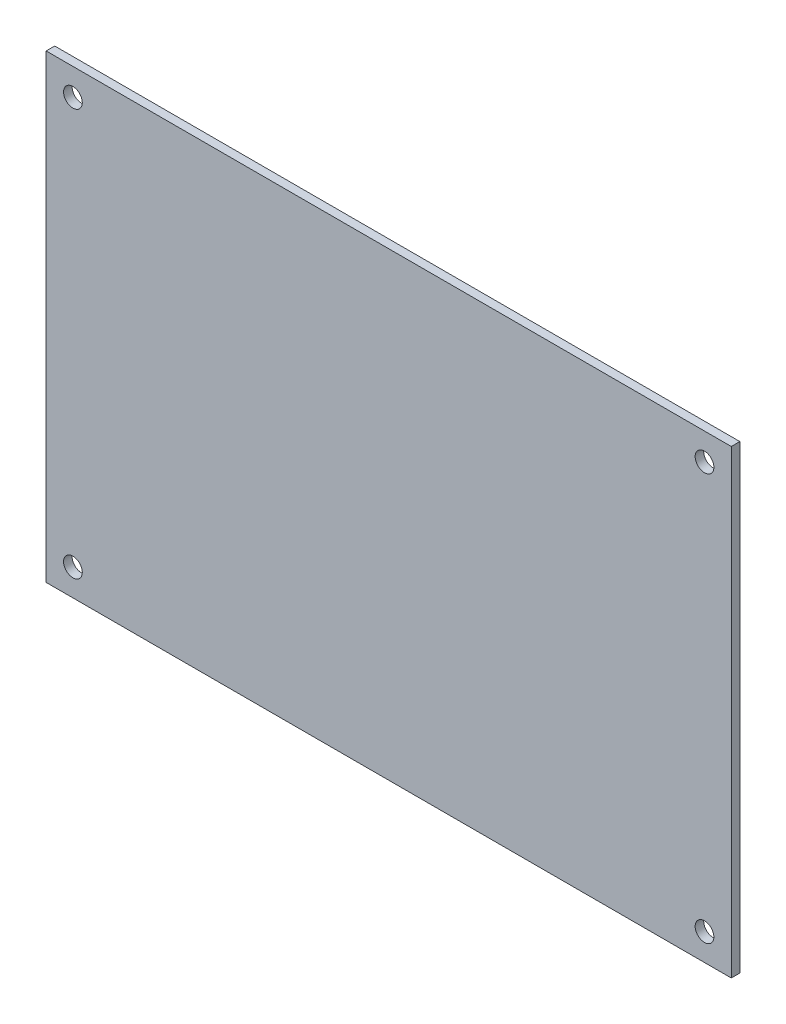
ISO-10303-21;
HEADER;
FILE_DESCRIPTION(('STEP AP214'),'2;1');
FILE_NAME('part.step','',(''),(''),'','','');
FILE_SCHEMA(('AUTOMOTIVE_DESIGN { 1 0 10303 214 1 1 1 1 }'));
ENDSEC;
DATA;
#1=APPLICATION_CONTEXT('core data for automotive mechanical design processes');
#2=APPLICATION_PROTOCOL_DEFINITION('international standard','automotive_design',2000,#1);
#3=PRODUCT_CONTEXT('',#1,'mechanical');
#4=PRODUCT('Part','Part','',(#3));
#5=PRODUCT_RELATED_PRODUCT_CATEGORY('part','',(#4));
#6=PRODUCT_DEFINITION_FORMATION('','',#4);
#7=PRODUCT_DEFINITION_CONTEXT('part definition',#1,'design');
#8=PRODUCT_DEFINITION('design','',#6,#7);
#9=PRODUCT_DEFINITION_SHAPE('','',#8);
#10=(LENGTH_UNIT() NAMED_UNIT(*) SI_UNIT(.MILLI.,.METRE.));
#11=(NAMED_UNIT(*) PLANE_ANGLE_UNIT() SI_UNIT($,.RADIAN.));
#12=(NAMED_UNIT(*) SI_UNIT($,.STERADIAN.) SOLID_ANGLE_UNIT());
#13=UNCERTAINTY_MEASURE_WITH_UNIT(LENGTH_MEASURE(1.E-05),#10,'distance_accuracy_value','');
#14=(GEOMETRIC_REPRESENTATION_CONTEXT(3) GLOBAL_UNCERTAINTY_ASSIGNED_CONTEXT((#13)) GLOBAL_UNIT_ASSIGNED_CONTEXT((#10,
#11,#12)) REPRESENTATION_CONTEXT('',''));
#15=CARTESIAN_POINT('',(0.,0.,0.));
#16=DIRECTION('',(0.,0.,1.));
#17=DIRECTION('',(1.,0.,0.));
#18=AXIS2_PLACEMENT_3D('',#15,#16,#17);
#19=CARTESIAN_POINT('',(39.9423506910812,22.6008886002444,0.5));
#20=DIRECTION('',(0.,0.,1.));
#21=DIRECTION('',(1.,0.,0.));
#22=AXIS2_PLACEMENT_3D('',#19,#20,#21);
#23=PLANE('',#22);
#24=DIRECTION('',(1.,0.,0.));
#25=VECTOR('',#24,1.);
#26=CARTESIAN_POINT('',(-14.0576493089189,55.6008886002444,0.5));
#27=LINE('',#26,#25);
#28=CARTESIAN_POINT('',(-14.0576493089188,55.6008886002444,0.5));
#29=VERTEX_POINT('',#28);
#30=CARTESIAN_POINT('',(93.9423506910812,55.6008886002444,0.5));
#31=VERTEX_POINT('',#30);
#32=EDGE_CURVE('E82',#29,#31,#27,.T.);
#33=ORIENTED_EDGE('',*,*,#32,.T.);
#34=DIRECTION('',(0.,1.,0.));
#35=VECTOR('',#34,1.);
#36=CARTESIAN_POINT('',(93.9423506910812,55.6008886002444,0.5));
#37=LINE('',#36,#35);
#38=CARTESIAN_POINT('',(93.9423506910812,-10.3991113997556,0.5));
#39=VERTEX_POINT('',#38);
#40=EDGE_CURVE('E79',#31,#39,#37,.F.);
#41=ORIENTED_EDGE('',*,*,#40,.T.);
#42=DIRECTION('',(1.,0.,0.));
#43=VECTOR('',#42,1.);
#44=CARTESIAN_POINT('',(93.9423506910812,-10.3991113997556,0.5));
#45=LINE('',#44,#43);
#46=CARTESIAN_POINT('',(-14.0576493089188,-10.3991113997556,0.5));
#47=VERTEX_POINT('',#46);
#48=EDGE_CURVE('E102',#39,#47,#45,.F.);
#49=ORIENTED_EDGE('',*,*,#48,.T.);
#50=DIRECTION('',(0.,1.,0.));
#51=VECTOR('',#50,1.);
#52=CARTESIAN_POINT('',(-14.0576493089188,-10.3991113997556,0.5));
#53=LINE('',#52,#51);
#54=EDGE_CURVE('E85',#47,#29,#53,.T.);
#55=ORIENTED_EDGE('',*,*,#54,.T.);
#56=EDGE_LOOP('',(#33,#41,#49,#55));
#57=FACE_BOUND('',#56,.T.);
#58=ADVANCED_FACE('F17',(#57),#23,.F.);
#59=CARTESIAN_POINT('',(-14.0576493089189,55.6008886002444,0.));
#60=DIRECTION('',(0.,1.,0.));
#61=DIRECTION('',(0.,0.,1.));
#62=AXIS2_PLACEMENT_3D('',#59,#60,#61);
#63=PLANE('',#62);
#64=DIRECTION('',(0.,0.,1.));
#65=VECTOR('',#64,1.);
#66=CARTESIAN_POINT('',(-14.0576493089188,55.6008886002444,0.));
#67=LINE('',#66,#65);
#68=CARTESIAN_POINT('',(-14.0576493089188,55.6008886002444,0.));
#69=VERTEX_POINT('',#68);
#70=EDGE_CURVE('E165',#29,#69,#67,.F.);
#71=ORIENTED_EDGE('',*,*,#70,.T.);
#72=DIRECTION('',(1.,0.,0.));
#73=VECTOR('',#72,1.);
#74=CARTESIAN_POINT('',(39.9423506910812,55.6008886002444,0.));
#75=LINE('',#74,#73);
#76=CARTESIAN_POINT('',(93.9423506910812,55.6008886002444,0.));
#77=VERTEX_POINT('',#76);
#78=EDGE_CURVE('E93',#69,#77,#75,.T.);
#79=ORIENTED_EDGE('',*,*,#78,.T.);
#80=DIRECTION('',(0.,0.,-1.));
#81=VECTOR('',#80,1.);
#82=CARTESIAN_POINT('',(93.9423506910812,55.6008886002444,0.));
#83=LINE('',#82,#81);
#84=EDGE_CURVE('E88',#77,#31,#83,.F.);
#85=ORIENTED_EDGE('',*,*,#84,.T.);
#86=ORIENTED_EDGE('',*,*,#32,.F.);
#87=EDGE_LOOP('',(#71,#79,#85,#86));
#88=FACE_BOUND('',#87,.T.);
#89=ADVANCED_FACE('F91',(#88),#63,.F.);
#90=CARTESIAN_POINT('',(93.9423506910812,55.6008886002444,0.));
#91=DIRECTION('',(1.,0.,0.));
#92=DIRECTION('',(0.,0.,-1.));
#93=AXIS2_PLACEMENT_3D('',#90,#91,#92);
#94=PLANE('',#93);
#95=ORIENTED_EDGE('',*,*,#84,.F.);
#96=DIRECTION('',(0.,1.,0.));
#97=VECTOR('',#96,1.);
#98=CARTESIAN_POINT('',(93.9423506910812,22.6008886002444,0.));
#99=LINE('',#98,#97);
#100=CARTESIAN_POINT('',(93.9423506910812,-10.3991113997556,0.));
#101=VERTEX_POINT('',#100);
#102=EDGE_CURVE('E158',#77,#101,#99,.F.);
#103=ORIENTED_EDGE('',*,*,#102,.T.);
#104=DIRECTION('',(0.,0.,-1.));
#105=VECTOR('',#104,1.);
#106=CARTESIAN_POINT('',(93.9423506910812,-10.3991113997556,0.));
#107=LINE('',#106,#105);
#108=EDGE_CURVE('E99',#101,#39,#107,.F.);
#109=ORIENTED_EDGE('',*,*,#108,.T.);
#110=ORIENTED_EDGE('',*,*,#40,.F.);
#111=EDGE_LOOP('',(#95,#103,#109,#110));
#112=FACE_BOUND('',#111,.T.);
#113=ADVANCED_FACE('F97',(#112),#94,.F.);
#114=CARTESIAN_POINT('',(93.9423506910812,-10.3991113997556,0.));
#115=DIRECTION('',(0.,-1.,0.));
#116=DIRECTION('',(0.,0.,-1.));
#117=AXIS2_PLACEMENT_3D('',#114,#115,#116);
#118=PLANE('',#117);
#119=ORIENTED_EDGE('',*,*,#108,.F.);
#120=DIRECTION('',(1.,0.,0.));
#121=VECTOR('',#120,1.);
#122=CARTESIAN_POINT('',(39.9423506910812,-10.3991113997556,0.));
#123=LINE('',#122,#121);
#124=CARTESIAN_POINT('',(-14.0576493089188,-10.3991113997556,0.));
#125=VERTEX_POINT('',#124);
#126=EDGE_CURVE('E156',#101,#125,#123,.F.);
#127=ORIENTED_EDGE('',*,*,#126,.T.);
#128=DIRECTION('',(0.,0.,1.));
#129=VECTOR('',#128,1.);
#130=CARTESIAN_POINT('',(-14.0576493089188,-10.3991113997556,0.));
#131=LINE('',#130,#129);
#132=EDGE_CURVE('E162',#125,#47,#131,.T.);
#133=ORIENTED_EDGE('',*,*,#132,.T.);
#134=ORIENTED_EDGE('',*,*,#48,.F.);
#135=EDGE_LOOP('',(#119,#127,#133,#134));
#136=FACE_BOUND('',#135,.T.);
#137=ADVANCED_FACE('F168',(#136),#118,.F.);
#138=CARTESIAN_POINT('',(-14.0576493089188,-10.3991113997556,0.));
#139=DIRECTION('',(-1.,0.,0.));
#140=DIRECTION('',(0.,0.,1.));
#141=AXIS2_PLACEMENT_3D('',#138,#139,#140);
#142=PLANE('',#141);
#143=ORIENTED_EDGE('',*,*,#132,.F.);
#144=DIRECTION('',(0.,1.,0.));
#145=VECTOR('',#144,1.);
#146=CARTESIAN_POINT('',(-14.0576493089188,22.6008886002444,0.));
#147=LINE('',#146,#145);
#148=EDGE_CURVE('E153',#125,#69,#147,.T.);
#149=ORIENTED_EDGE('',*,*,#148,.T.);
#150=ORIENTED_EDGE('',*,*,#70,.F.);
#151=ORIENTED_EDGE('',*,*,#54,.F.);
#152=EDGE_LOOP('',(#143,#149,#150,#151));
#153=FACE_BOUND('',#152,.T.);
#154=ADVANCED_FACE('F172',(#153),#142,.F.);
#155=CARTESIAN_POINT('',(39.9423506910812,22.6008886002444,0.));
#156=DIRECTION('',(0.,0.,1.));
#157=DIRECTION('',(1.,0.,0.));
#158=AXIS2_PLACEMENT_3D('',#155,#156,#157);
#159=PLANE('',#158);
#160=ORIENTED_EDGE('',*,*,#126,.F.);
#161=ORIENTED_EDGE('',*,*,#102,.F.);
#162=ORIENTED_EDGE('',*,*,#78,.F.);
#163=ORIENTED_EDGE('',*,*,#148,.F.);
#164=EDGE_LOOP('',(#160,#161,#162,#163));
#165=FACE_BOUND('',#164,.T.);
#166=CARTESIAN_POINT('',(-19.0576493089189,60.6008886002444,0.));
#167=DIRECTION('',(0.,0.,1.));
#168=DIRECTION('',(1.,0.,0.));
#169=AXIS2_PLACEMENT_3D('',#166,#167,#168);
#170=CIRCLE('',#169,1.75);
#171=CARTESIAN_POINT('',(-17.3076493089189,60.6008886002444,0.));
#172=VERTEX_POINT('',#171);
#173=EDGE_CURVE('E115',#172,#172,#170,.T.);
#174=ORIENTED_EDGE('',*,*,#173,.T.);
#175=EDGE_LOOP('',(#174));
#176=FACE_BOUND('',#175,.T.);
#177=CARTESIAN_POINT('',(98.9423506910811,60.6008886002444,0.));
#178=DIRECTION('',(0.,0.,1.));
#179=DIRECTION('',(1.,0.,0.));
#180=AXIS2_PLACEMENT_3D('',#177,#178,#179);
#181=CIRCLE('',#180,1.75);
#182=CARTESIAN_POINT('',(100.692350691081,60.6008886002444,0.));
#183=VERTEX_POINT('',#182);
#184=EDGE_CURVE('E119',#183,#183,#181,.T.);
#185=ORIENTED_EDGE('',*,*,#184,.T.);
#186=EDGE_LOOP('',(#185));
#187=FACE_BOUND('',#186,.T.);
#188=CARTESIAN_POINT('',(98.9423506910812,-15.3991113997556,0.));
#189=DIRECTION('',(0.,0.,1.));
#190=DIRECTION('',(1.,0.,0.));
#191=AXIS2_PLACEMENT_3D('',#188,#189,#190);
#192=CIRCLE('',#191,1.75);
#193=CARTESIAN_POINT('',(100.692350691081,-15.3991113997556,0.));
#194=VERTEX_POINT('',#193);
#195=EDGE_CURVE('E121',#194,#194,#192,.T.);
#196=ORIENTED_EDGE('',*,*,#195,.T.);
#197=EDGE_LOOP('',(#196));
#198=FACE_BOUND('',#197,.T.);
#199=CARTESIAN_POINT('',(-19.0576493089188,-15.3991113997556,0.));
#200=DIRECTION('',(0.,0.,1.));
#201=DIRECTION('',(1.,0.,0.));
#202=AXIS2_PLACEMENT_3D('',#199,#200,#201);
#203=CIRCLE('',#202,1.75);
#204=CARTESIAN_POINT('',(-17.3076493089188,-15.3991113997556,0.));
#205=VERTEX_POINT('',#204);
#206=EDGE_CURVE('E20',#205,#205,#203,.T.);
#207=ORIENTED_EDGE('',*,*,#206,.T.);
#208=EDGE_LOOP('',(#207));
#209=FACE_BOUND('',#208,.T.);
#210=DIRECTION('',(0.,1.,0.));
#211=VECTOR('',#210,1.);
#212=CARTESIAN_POINT('',(103.942350691081,65.6008886002444,0.));
#213=LINE('',#212,#211);
#214=CARTESIAN_POINT('',(103.942350691081,-20.3991113997556,0.));
#215=VERTEX_POINT('',#214);
#216=CARTESIAN_POINT('',(103.942350691081,65.6008886002444,0.));
#217=VERTEX_POINT('',#216);
#218=EDGE_CURVE('E151',#215,#217,#213,.T.);
#219=ORIENTED_EDGE('',*,*,#218,.F.);
#220=DIRECTION('',(1.,0.,0.));
#221=VECTOR('',#220,1.);
#222=CARTESIAN_POINT('',(103.942350691081,-20.3991113997556,0.));
#223=LINE('',#222,#221);
#224=CARTESIAN_POINT('',(-24.0576493089189,-20.3991113997556,0.));
#225=VERTEX_POINT('',#224);
#226=EDGE_CURVE('E130',#225,#215,#223,.T.);
#227=ORIENTED_EDGE('',*,*,#226,.F.);
#228=DIRECTION('',(0.,1.,0.));
#229=VECTOR('',#228,1.);
#230=CARTESIAN_POINT('',(-24.0576493089188,-20.3991113997556,0.));
#231=LINE('',#230,#229);
#232=CARTESIAN_POINT('',(-24.0576493089189,65.6008886002444,0.));
#233=VERTEX_POINT('',#232);
#234=EDGE_CURVE('E141',#233,#225,#231,.F.);
#235=ORIENTED_EDGE('',*,*,#234,.F.);
#236=DIRECTION('',(1.,0.,0.));
#237=VECTOR('',#236,1.);
#238=CARTESIAN_POINT('',(-24.0576493089189,65.6008886002444,0.));
#239=LINE('',#238,#237);
#240=EDGE_CURVE('E146',#217,#233,#239,.F.);
#241=ORIENTED_EDGE('',*,*,#240,.F.);
#242=EDGE_LOOP('',(#219,#227,#235,#241));
#243=FACE_BOUND('',#242,.T.);
#244=ADVANCED_FACE('F174',(#165,#176,#187,#198,#209,#243),#159,.F.);
#245=CARTESIAN_POINT('',(103.942350691081,65.6008886002444,0.));
#246=DIRECTION('',(1.,0.,0.));
#247=DIRECTION('',(0.,0.,-1.));
#248=AXIS2_PLACEMENT_3D('',#245,#246,#247);
#249=PLANE('',#248);
#250=ORIENTED_EDGE('',*,*,#218,.T.);
#251=DIRECTION('',(0.,0.,1.));
#252=VECTOR('',#251,1.);
#253=CARTESIAN_POINT('',(103.942350691081,65.6008886002444,0.));
#254=LINE('',#253,#252);
#255=CARTESIAN_POINT('',(103.942350691081,65.6008886002444,1.6));
#256=VERTEX_POINT('',#255);
#257=EDGE_CURVE('E148',#256,#217,#254,.F.);
#258=ORIENTED_EDGE('',*,*,#257,.F.);
#259=DIRECTION('',(0.,1.,0.));
#260=VECTOR('',#259,1.);
#261=CARTESIAN_POINT('',(103.942350691081,22.6008886002444,1.6));
#262=LINE('',#261,#260);
#263=CARTESIAN_POINT('',(103.942350691081,-20.3991113997556,1.6));
#264=VERTEX_POINT('',#263);
#265=EDGE_CURVE('E118',#264,#256,#262,.T.);
#266=ORIENTED_EDGE('',*,*,#265,.F.);
#267=DIRECTION('',(0.,0.,-1.));
#268=VECTOR('',#267,1.);
#269=CARTESIAN_POINT('',(103.942350691081,-20.3991113997556,0.));
#270=LINE('',#269,#268);
#271=EDGE_CURVE('E126',#215,#264,#270,.F.);
#272=ORIENTED_EDGE('',*,*,#271,.F.);
#273=EDGE_LOOP('',(#250,#258,#266,#272));
#274=FACE_BOUND('',#273,.T.);
#275=ADVANCED_FACE('F177',(#274),#249,.T.);
#276=CARTESIAN_POINT('',(-24.0576493089189,65.6008886002444,0.));
#277=DIRECTION('',(0.,1.,0.));
#278=DIRECTION('',(0.,0.,1.));
#279=AXIS2_PLACEMENT_3D('',#276,#277,#278);
#280=PLANE('',#279);
#281=ORIENTED_EDGE('',*,*,#240,.T.);
#282=DIRECTION('',(0.,0.,1.));
#283=VECTOR('',#282,1.);
#284=CARTESIAN_POINT('',(-24.0576493089188,65.6008886002444,0.));
#285=LINE('',#284,#283);
#286=CARTESIAN_POINT('',(-24.0576493089189,65.6008886002444,1.6));
#287=VERTEX_POINT('',#286);
#288=EDGE_CURVE('E143',#287,#233,#285,.F.);
#289=ORIENTED_EDGE('',*,*,#288,.F.);
#290=DIRECTION('',(1.,0.,0.));
#291=VECTOR('',#290,1.);
#292=CARTESIAN_POINT('',(39.9423506910812,65.6008886002444,1.6));
#293=LINE('',#292,#291);
#294=EDGE_CURVE('E196',#256,#287,#293,.F.);
#295=ORIENTED_EDGE('',*,*,#294,.F.);
#296=ORIENTED_EDGE('',*,*,#257,.T.);
#297=EDGE_LOOP('',(#281,#289,#295,#296));
#298=FACE_BOUND('',#297,.T.);
#299=ADVANCED_FACE('F200',(#298),#280,.T.);
#300=CARTESIAN_POINT('',(-24.0576493089188,-20.3991113997556,0.));
#301=DIRECTION('',(-1.,0.,0.));
#302=DIRECTION('',(0.,0.,1.));
#303=AXIS2_PLACEMENT_3D('',#300,#301,#302);
#304=PLANE('',#303);
#305=ORIENTED_EDGE('',*,*,#234,.T.);
#306=DIRECTION('',(0.,0.,-1.));
#307=VECTOR('',#306,1.);
#308=CARTESIAN_POINT('',(-24.0576493089188,-20.3991113997556,0.));
#309=LINE('',#308,#307);
#310=CARTESIAN_POINT('',(-24.0576493089189,-20.3991113997556,1.6));
#311=VERTEX_POINT('',#310);
#312=EDGE_CURVE('E35',#311,#225,#309,.T.);
#313=ORIENTED_EDGE('',*,*,#312,.F.);
#314=DIRECTION('',(0.,1.,0.));
#315=VECTOR('',#314,1.);
#316=CARTESIAN_POINT('',(-24.0576493089189,22.6008886002444,1.6));
#317=LINE('',#316,#315);
#318=EDGE_CURVE('E191',#287,#311,#317,.F.);
#319=ORIENTED_EDGE('',*,*,#318,.F.);
#320=ORIENTED_EDGE('',*,*,#288,.T.);
#321=EDGE_LOOP('',(#305,#313,#319,#320));
#322=FACE_BOUND('',#321,.T.);
#323=ADVANCED_FACE('F198',(#322),#304,.T.);
#324=CARTESIAN_POINT('',(103.942350691081,-20.3991113997556,0.));
#325=DIRECTION('',(0.,-1.,0.));
#326=DIRECTION('',(0.,0.,-1.));
#327=AXIS2_PLACEMENT_3D('',#324,#325,#326);
#328=PLANE('',#327);
#329=ORIENTED_EDGE('',*,*,#226,.T.);
#330=ORIENTED_EDGE('',*,*,#271,.T.);
#331=DIRECTION('',(1.,0.,0.));
#332=VECTOR('',#331,1.);
#333=CARTESIAN_POINT('',(39.9423506910812,-20.3991113997556,1.6));
#334=LINE('',#333,#332);
#335=EDGE_CURVE('E114',#311,#264,#334,.T.);
#336=ORIENTED_EDGE('',*,*,#335,.F.);
#337=ORIENTED_EDGE('',*,*,#312,.T.);
#338=EDGE_LOOP('',(#329,#330,#336,#337));
#339=FACE_BOUND('',#338,.T.);
#340=ADVANCED_FACE('F188',(#339),#328,.T.);
#341=CARTESIAN_POINT('',(-19.0576493089188,-15.3991113997556,-2.4));
#342=DIRECTION('',(0.,0.,1.));
#343=DIRECTION('',(1.,0.,0.));
#344=AXIS2_PLACEMENT_3D('',#341,#342,#343);
#345=CYLINDRICAL_SURFACE('',#344,1.75);
#346=CARTESIAN_POINT('',(-19.0576493089188,-15.3991113997556,1.6));
#347=DIRECTION('',(0.,0.,1.));
#348=DIRECTION('',(1.,0.,0.));
#349=AXIS2_PLACEMENT_3D('',#346,#347,#348);
#350=CIRCLE('',#349,1.75);
#351=CARTESIAN_POINT('',(-17.3076493089188,-15.3991113997556,1.6));
#352=VERTEX_POINT('',#351);
#353=EDGE_CURVE('E111',#352,#352,#350,.F.);
#354=ORIENTED_EDGE('',*,*,#353,.F.);
#355=EDGE_LOOP('',(#354));
#356=FACE_BOUND('',#355,.T.);
#357=ORIENTED_EDGE('',*,*,#206,.F.);
#358=EDGE_LOOP('',(#357));
#359=FACE_BOUND('',#358,.T.);
#360=ADVANCED_FACE('F228',(#356,#359),#345,.F.);
#361=CARTESIAN_POINT('',(98.9423506910812,-15.3991113997556,-2.4));
#362=DIRECTION('',(0.,0.,1.));
#363=DIRECTION('',(1.,0.,0.));
#364=AXIS2_PLACEMENT_3D('',#361,#362,#363);
#365=CYLINDRICAL_SURFACE('',#364,1.75);
#366=CARTESIAN_POINT('',(98.9423506910812,-15.3991113997556,1.6));
#367=DIRECTION('',(0.,0.,1.));
#368=DIRECTION('',(1.,0.,0.));
#369=AXIS2_PLACEMENT_3D('',#366,#367,#368);
#370=CIRCLE('',#369,1.75);
#371=CARTESIAN_POINT('',(100.692350691081,-15.3991113997556,1.6));
#372=VERTEX_POINT('',#371);
#373=EDGE_CURVE('E108',#372,#372,#370,.F.);
#374=ORIENTED_EDGE('',*,*,#373,.F.);
#375=EDGE_LOOP('',(#374));
#376=FACE_BOUND('',#375,.T.);
#377=ORIENTED_EDGE('',*,*,#195,.F.);
#378=EDGE_LOOP('',(#377));
#379=FACE_BOUND('',#378,.T.);
#380=ADVANCED_FACE('F224',(#376,#379),#365,.F.);
#381=CARTESIAN_POINT('',(98.9423506910811,60.6008886002444,-2.4));
#382=DIRECTION('',(0.,0.,1.));
#383=DIRECTION('',(1.,0.,0.));
#384=AXIS2_PLACEMENT_3D('',#381,#382,#383);
#385=CYLINDRICAL_SURFACE('',#384,1.75);
#386=CARTESIAN_POINT('',(98.9423506910811,60.6008886002444,1.6));
#387=DIRECTION('',(0.,0.,1.));
#388=DIRECTION('',(1.,0.,0.));
#389=AXIS2_PLACEMENT_3D('',#386,#387,#388);
#390=CIRCLE('',#389,1.75);
#391=CARTESIAN_POINT('',(100.692350691081,60.6008886002444,1.6));
#392=VERTEX_POINT('',#391);
#393=EDGE_CURVE('E26',#392,#392,#390,.F.);
#394=ORIENTED_EDGE('',*,*,#393,.F.);
#395=EDGE_LOOP('',(#394));
#396=FACE_BOUND('',#395,.T.);
#397=ORIENTED_EDGE('',*,*,#184,.F.);
#398=EDGE_LOOP('',(#397));
#399=FACE_BOUND('',#398,.T.);
#400=ADVANCED_FACE('F217',(#396,#399),#385,.F.);
#401=CARTESIAN_POINT('',(-19.0576493089189,60.6008886002444,-2.4));
#402=DIRECTION('',(0.,0.,1.));
#403=DIRECTION('',(1.,0.,0.));
#404=AXIS2_PLACEMENT_3D('',#401,#402,#403);
#405=CYLINDRICAL_SURFACE('',#404,1.75);
#406=CARTESIAN_POINT('',(-19.0576493089189,60.6008886002444,1.6));
#407=DIRECTION('',(0.,0.,1.));
#408=DIRECTION('',(1.,0.,0.));
#409=AXIS2_PLACEMENT_3D('',#406,#407,#408);
#410=CIRCLE('',#409,1.75);
#411=CARTESIAN_POINT('',(-17.3076493089189,60.6008886002444,1.6));
#412=VERTEX_POINT('',#411);
#413=EDGE_CURVE('E11',#412,#412,#410,.F.);
#414=ORIENTED_EDGE('',*,*,#413,.F.);
#415=EDGE_LOOP('',(#414));
#416=FACE_BOUND('',#415,.T.);
#417=ORIENTED_EDGE('',*,*,#173,.F.);
#418=EDGE_LOOP('',(#417));
#419=FACE_BOUND('',#418,.T.);
#420=ADVANCED_FACE('F211',(#416,#419),#405,.F.);
#421=CARTESIAN_POINT('',(39.9423506910812,22.6008886002444,1.6));
#422=DIRECTION('',(0.,0.,1.));
#423=DIRECTION('',(1.,0.,0.));
#424=AXIS2_PLACEMENT_3D('',#421,#422,#423);
#425=PLANE('',#424);
#426=ORIENTED_EDGE('',*,*,#413,.T.);
#427=EDGE_LOOP('',(#426));
#428=FACE_BOUND('',#427,.T.);
#429=ORIENTED_EDGE('',*,*,#393,.T.);
#430=EDGE_LOOP('',(#429));
#431=FACE_BOUND('',#430,.T.);
#432=ORIENTED_EDGE('',*,*,#373,.T.);
#433=EDGE_LOOP('',(#432));
#434=FACE_BOUND('',#433,.T.);
#435=ORIENTED_EDGE('',*,*,#353,.T.);
#436=EDGE_LOOP('',(#435));
#437=FACE_BOUND('',#436,.T.);
#438=ORIENTED_EDGE('',*,*,#318,.T.);
#439=ORIENTED_EDGE('',*,*,#335,.T.);
#440=ORIENTED_EDGE('',*,*,#265,.T.);
#441=ORIENTED_EDGE('',*,*,#294,.T.);
#442=EDGE_LOOP('',(#438,#439,#440,#441));
#443=FACE_BOUND('',#442,.T.);
#444=ADVANCED_FACE('F194',(#428,#431,#434,#437,#443),#425,.T.);
#445=CLOSED_SHELL('',(#58,#89,#113,#137,#154,#244,#275,#299,#323,#340,#360,#380,#400,#420,#444));
#446=MANIFOLD_SOLID_BREP('B1',#445);
#447=ADVANCED_BREP_SHAPE_REPRESENTATION('',(#18,#446),#14);
#448=SHAPE_DEFINITION_REPRESENTATION(#9,#447);
ENDSEC;
END-ISO-10303-21;
